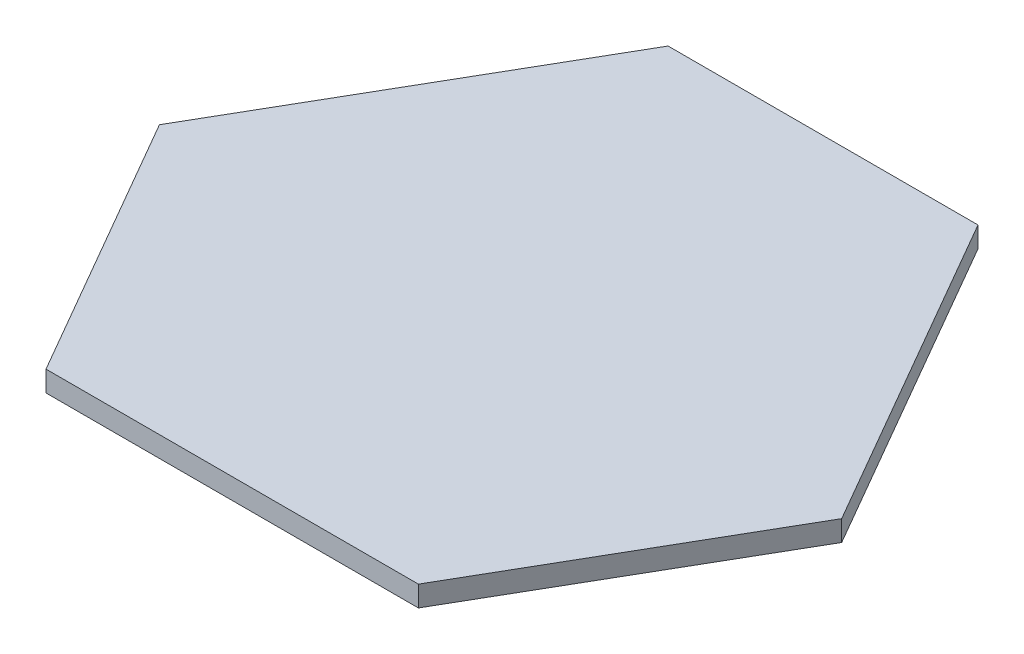
ISO-10303-21;
HEADER;
FILE_DESCRIPTION(('STEP AP214'),'2;1');
FILE_NAME('part.step','',(''),(''),'','','');
FILE_SCHEMA(('AUTOMOTIVE_DESIGN { 1 0 10303 214 1 1 1 1 }'));
ENDSEC;
DATA;
#1=APPLICATION_CONTEXT('core data for automotive mechanical design processes');
#2=APPLICATION_PROTOCOL_DEFINITION('international standard','automotive_design',2000,#1);
#3=PRODUCT_CONTEXT('',#1,'mechanical');
#4=PRODUCT('Part','Part','',(#3));
#5=PRODUCT_RELATED_PRODUCT_CATEGORY('part','',(#4));
#6=PRODUCT_DEFINITION_FORMATION('','',#4);
#7=PRODUCT_DEFINITION_CONTEXT('part definition',#1,'design');
#8=PRODUCT_DEFINITION('design','',#6,#7);
#9=PRODUCT_DEFINITION_SHAPE('','',#8);
#10=(LENGTH_UNIT() NAMED_UNIT(*) SI_UNIT(.MILLI.,.METRE.));
#11=(NAMED_UNIT(*) PLANE_ANGLE_UNIT() SI_UNIT($,.RADIAN.));
#12=(NAMED_UNIT(*) SI_UNIT($,.STERADIAN.) SOLID_ANGLE_UNIT());
#13=UNCERTAINTY_MEASURE_WITH_UNIT(LENGTH_MEASURE(1.E-05),#10,'distance_accuracy_value','');
#14=(GEOMETRIC_REPRESENTATION_CONTEXT(3) GLOBAL_UNCERTAINTY_ASSIGNED_CONTEXT((#13)) GLOBAL_UNIT_ASSIGNED_CONTEXT((#10,
#11,#12)) REPRESENTATION_CONTEXT('',''));
#15=CARTESIAN_POINT('',(0.,0.,0.));
#16=DIRECTION('',(0.,0.,1.));
#17=DIRECTION('',(1.,0.,0.));
#18=AXIS2_PLACEMENT_3D('',#15,#16,#17);
#19=CARTESIAN_POINT('',(-165.122176988227,10.,-129.903810567666));
#20=DIRECTION('',(0.866025403784439,0.,-0.5));
#21=DIRECTION('',(-0.5,0.,-0.866025403784439));
#22=AXIS2_PLACEMENT_3D('',#19,#20,#21);
#23=PLANE('',#22);
#24=DIRECTION('',(0.5,0.,0.866025403784439));
#25=VECTOR('',#24,1.);
#26=CARTESIAN_POINT('',(-165.122176988227,0.,-129.903810567666));
#27=LINE('',#26,#25);
#28=CARTESIAN_POINT('',(-165.122176988227,0.,-129.903810567666));
#29=VERTEX_POINT('',#28);
#30=CARTESIAN_POINT('',(-90.1221769882273,0.,0.));
#31=VERTEX_POINT('',#30);
#32=EDGE_CURVE('E117',#29,#31,#27,.T.);
#33=ORIENTED_EDGE('',*,*,#32,.T.);
#34=DIRECTION('',(0.,-1.,0.));
#35=VECTOR('',#34,1.);
#36=CARTESIAN_POINT('',(-90.1221769882273,10.,0.));
#37=LINE('',#36,#35);
#38=CARTESIAN_POINT('',(-90.1221769882273,10.,0.));
#39=VERTEX_POINT('',#38);
#40=EDGE_CURVE('E11',#39,#31,#37,.T.);
#41=ORIENTED_EDGE('',*,*,#40,.F.);
#42=DIRECTION('',(0.5,0.,0.866025403784439));
#43=VECTOR('',#42,1.);
#44=CARTESIAN_POINT('',(-165.122176988227,10.,-129.903810567666));
#45=LINE('',#44,#43);
#46=CARTESIAN_POINT('',(-165.122176988227,10.,-129.903810567666));
#47=VERTEX_POINT('',#46);
#48=EDGE_CURVE('E127',#47,#39,#45,.T.);
#49=ORIENTED_EDGE('',*,*,#48,.F.);
#50=DIRECTION('',(0.,-1.,0.));
#51=VECTOR('',#50,1.);
#52=CARTESIAN_POINT('',(-165.122176988227,10.,-129.903810567666));
#53=LINE('',#52,#51);
#54=EDGE_CURVE('E113',#47,#29,#53,.T.);
#55=ORIENTED_EDGE('',*,*,#54,.T.);
#56=EDGE_LOOP('',(#33,#41,#49,#55));
#57=FACE_BOUND('',#56,.T.);
#58=ADVANCED_FACE('F33',(#57),#23,.F.);
#59=CARTESIAN_POINT('',(-90.1221769882273,10.,0.));
#60=DIRECTION('',(0.,0.,-1.));
#61=DIRECTION('',(-1.,0.,0.));
#62=AXIS2_PLACEMENT_3D('',#59,#60,#61);
#63=PLANE('',#62);
#64=DIRECTION('',(1.,0.,0.));
#65=VECTOR('',#64,1.);
#66=CARTESIAN_POINT('',(-90.1221769882273,0.,0.));
#67=LINE('',#66,#65);
#68=CARTESIAN_POINT('',(90.1221769882257,0.,0.));
#69=VERTEX_POINT('',#68);
#70=EDGE_CURVE('E120',#31,#69,#67,.T.);
#71=ORIENTED_EDGE('',*,*,#70,.T.);
#72=DIRECTION('',(0.,-1.,0.));
#73=VECTOR('',#72,1.);
#74=CARTESIAN_POINT('',(90.1221769882257,10.,0.));
#75=LINE('',#74,#73);
#76=CARTESIAN_POINT('',(90.1221769882257,10.,0.));
#77=VERTEX_POINT('',#76);
#78=EDGE_CURVE('E41',#77,#69,#75,.T.);
#79=ORIENTED_EDGE('',*,*,#78,.F.);
#80=DIRECTION('',(1.,0.,0.));
#81=VECTOR('',#80,1.);
#82=CARTESIAN_POINT('',(-90.1221769882273,10.,0.));
#83=LINE('',#82,#81);
#84=EDGE_CURVE('E86',#39,#77,#83,.T.);
#85=ORIENTED_EDGE('',*,*,#84,.F.);
#86=ORIENTED_EDGE('',*,*,#40,.T.);
#87=EDGE_LOOP('',(#71,#79,#85,#86));
#88=FACE_BOUND('',#87,.T.);
#89=ADVANCED_FACE('F151',(#88),#63,.F.);
#90=CARTESIAN_POINT('',(90.1221769882257,10.,0.));
#91=DIRECTION('',(-0.866025403784434,0.,-0.500000000000008));
#92=DIRECTION('',(-0.500000000000008,0.,0.866025403784434));
#93=AXIS2_PLACEMENT_3D('',#90,#91,#92);
#94=PLANE('',#93);
#95=DIRECTION('',(0.500000000000008,0.,-0.866025403784434));
#96=VECTOR('',#95,1.);
#97=CARTESIAN_POINT('',(90.1221769882257,0.,0.));
#98=LINE('',#97,#96);
#99=CARTESIAN_POINT('',(165.122176988227,0.,-129.903810567666));
#100=VERTEX_POINT('',#99);
#101=EDGE_CURVE('E122',#69,#100,#98,.T.);
#102=ORIENTED_EDGE('',*,*,#101,.T.);
#103=DIRECTION('',(0.,-1.,0.));
#104=VECTOR('',#103,1.);
#105=CARTESIAN_POINT('',(165.122176988227,10.,-129.903810567666));
#106=LINE('',#105,#104);
#107=CARTESIAN_POINT('',(165.122176988227,10.,-129.903810567666));
#108=VERTEX_POINT('',#107);
#109=EDGE_CURVE('E108',#108,#100,#106,.T.);
#110=ORIENTED_EDGE('',*,*,#109,.F.);
#111=DIRECTION('',(0.500000000000008,0.,-0.866025403784434));
#112=VECTOR('',#111,1.);
#113=CARTESIAN_POINT('',(90.1221769882257,10.,0.));
#114=LINE('',#113,#112);
#115=EDGE_CURVE('E99',#77,#108,#114,.T.);
#116=ORIENTED_EDGE('',*,*,#115,.F.);
#117=ORIENTED_EDGE('',*,*,#78,.T.);
#118=EDGE_LOOP('',(#102,#110,#116,#117));
#119=FACE_BOUND('',#118,.T.);
#120=ADVANCED_FACE('F133',(#119),#94,.F.);
#121=CARTESIAN_POINT('',(165.122176988227,10.,-129.903810567666));
#122=DIRECTION('',(-0.866025403784434,0.,0.500000000000007));
#123=DIRECTION('',(0.500000000000007,0.,0.866025403784435));
#124=AXIS2_PLACEMENT_3D('',#121,#122,#123);
#125=PLANE('',#124);
#126=DIRECTION('',(-0.500000000000007,0.,-0.866025403784435));
#127=VECTOR('',#126,1.);
#128=CARTESIAN_POINT('',(165.122176988227,0.,-129.903810567666));
#129=LINE('',#128,#127);
#130=CARTESIAN_POINT('',(74.9999999999926,0.,-286.));
#131=VERTEX_POINT('',#130);
#132=EDGE_CURVE('E107',#100,#131,#129,.T.);
#133=ORIENTED_EDGE('',*,*,#132,.T.);
#134=DIRECTION('',(0.,-1.,0.));
#135=VECTOR('',#134,1.);
#136=CARTESIAN_POINT('',(74.9999999999926,10.,-286.));
#137=LINE('',#136,#135);
#138=CARTESIAN_POINT('',(74.9999999999926,10.,-286.));
#139=VERTEX_POINT('',#138);
#140=EDGE_CURVE('E104',#139,#131,#137,.T.);
#141=ORIENTED_EDGE('',*,*,#140,.F.);
#142=DIRECTION('',(-0.500000000000007,0.,-0.866025403784435));
#143=VECTOR('',#142,1.);
#144=CARTESIAN_POINT('',(165.122176988227,10.,-129.903810567666));
#145=LINE('',#144,#143);
#146=EDGE_CURVE('E93',#108,#139,#145,.T.);
#147=ORIENTED_EDGE('',*,*,#146,.F.);
#148=ORIENTED_EDGE('',*,*,#109,.T.);
#149=EDGE_LOOP('',(#133,#141,#147,#148));
#150=FACE_BOUND('',#149,.T.);
#151=ADVANCED_FACE('F105',(#150),#125,.F.);
#152=CARTESIAN_POINT('',(74.9999999999926,10.,-286.));
#153=DIRECTION('',(0.,0.,1.));
#154=DIRECTION('',(1.,0.,0.));
#155=AXIS2_PLACEMENT_3D('',#152,#153,#154);
#156=PLANE('',#155);
#157=DIRECTION('',(-1.,0.,0.));
#158=VECTOR('',#157,1.);
#159=CARTESIAN_POINT('',(74.9999999999926,0.,-286.));
#160=LINE('',#159,#158);
#161=CARTESIAN_POINT('',(-74.9999999999965,0.,-286.));
#162=VERTEX_POINT('',#161);
#163=EDGE_CURVE('E72',#131,#162,#160,.T.);
#164=ORIENTED_EDGE('',*,*,#163,.T.);
#165=DIRECTION('',(0.,-1.,0.));
#166=VECTOR('',#165,1.);
#167=CARTESIAN_POINT('',(-74.9999999999965,10.,-286.));
#168=LINE('',#167,#166);
#169=CARTESIAN_POINT('',(-74.9999999999965,10.,-286.));
#170=VERTEX_POINT('',#169);
#171=EDGE_CURVE('E109',#170,#162,#168,.T.);
#172=ORIENTED_EDGE('',*,*,#171,.F.);
#173=DIRECTION('',(-1.,0.,0.));
#174=VECTOR('',#173,1.);
#175=CARTESIAN_POINT('',(74.9999999999926,10.,-286.));
#176=LINE('',#175,#174);
#177=EDGE_CURVE('E97',#139,#170,#176,.T.);
#178=ORIENTED_EDGE('',*,*,#177,.F.);
#179=ORIENTED_EDGE('',*,*,#140,.T.);
#180=EDGE_LOOP('',(#164,#172,#178,#179));
#181=FACE_BOUND('',#180,.T.);
#182=ADVANCED_FACE('F111',(#181),#156,.F.);
#183=CARTESIAN_POINT('',(-74.9999999999965,10.,-286.));
#184=DIRECTION('',(0.866025403784444,0.,0.499999999999991));
#185=DIRECTION('',(0.499999999999991,0.,-0.866025403784444));
#186=AXIS2_PLACEMENT_3D('',#183,#184,#185);
#187=PLANE('',#186);
#188=DIRECTION('',(-0.499999999999991,0.,0.866025403784444));
#189=VECTOR('',#188,1.);
#190=CARTESIAN_POINT('',(-74.9999999999965,0.,-286.));
#191=LINE('',#190,#189);
#192=EDGE_CURVE('E78',#162,#29,#191,.T.);
#193=ORIENTED_EDGE('',*,*,#192,.T.);
#194=ORIENTED_EDGE('',*,*,#54,.F.);
#195=DIRECTION('',(-0.499999999999991,0.,0.866025403784444));
#196=VECTOR('',#195,1.);
#197=CARTESIAN_POINT('',(-74.9999999999965,10.,-286.));
#198=LINE('',#197,#196);
#199=EDGE_CURVE('E49',#170,#47,#198,.T.);
#200=ORIENTED_EDGE('',*,*,#199,.F.);
#201=ORIENTED_EDGE('',*,*,#171,.T.);
#202=EDGE_LOOP('',(#193,#194,#200,#201));
#203=FACE_BOUND('',#202,.T.);
#204=ADVANCED_FACE('F140',(#203),#187,.F.);
#205=CARTESIAN_POINT('',(0.,10.,0.));
#206=DIRECTION('',(0.,1.,0.));
#207=DIRECTION('',(0.,0.,1.));
#208=AXIS2_PLACEMENT_3D('',#205,#206,#207);
#209=PLANE('',#208);
#210=ORIENTED_EDGE('',*,*,#48,.T.);
#211=ORIENTED_EDGE('',*,*,#84,.T.);
#212=ORIENTED_EDGE('',*,*,#115,.T.);
#213=ORIENTED_EDGE('',*,*,#146,.T.);
#214=ORIENTED_EDGE('',*,*,#177,.T.);
#215=ORIENTED_EDGE('',*,*,#199,.T.);
#216=EDGE_LOOP('',(#210,#211,#212,#213,#214,#215));
#217=FACE_BOUND('',#216,.T.);
#218=ADVANCED_FACE('F95',(#217),#209,.T.);
#219=CARTESIAN_POINT('',(0.,0.,0.));
#220=DIRECTION('',(0.,1.,0.));
#221=DIRECTION('',(0.,0.,1.));
#222=AXIS2_PLACEMENT_3D('',#219,#220,#221);
#223=PLANE('',#222);
#224=ORIENTED_EDGE('',*,*,#32,.F.);
#225=ORIENTED_EDGE('',*,*,#192,.F.);
#226=ORIENTED_EDGE('',*,*,#163,.F.);
#227=ORIENTED_EDGE('',*,*,#132,.F.);
#228=ORIENTED_EDGE('',*,*,#101,.F.);
#229=ORIENTED_EDGE('',*,*,#70,.F.);
#230=EDGE_LOOP('',(#224,#225,#226,#227,#228,#229));
#231=FACE_BOUND('',#230,.T.);
#232=ADVANCED_FACE('F136',(#231),#223,.F.);
#233=CLOSED_SHELL('',(#58,#89,#120,#151,#182,#204,#218,#232));
#234=MANIFOLD_SOLID_BREP('B2',#233);
#235=ADVANCED_BREP_SHAPE_REPRESENTATION('',(#18,#234),#14);
#236=SHAPE_DEFINITION_REPRESENTATION(#9,#235);
ENDSEC;
END-ISO-10303-21;
